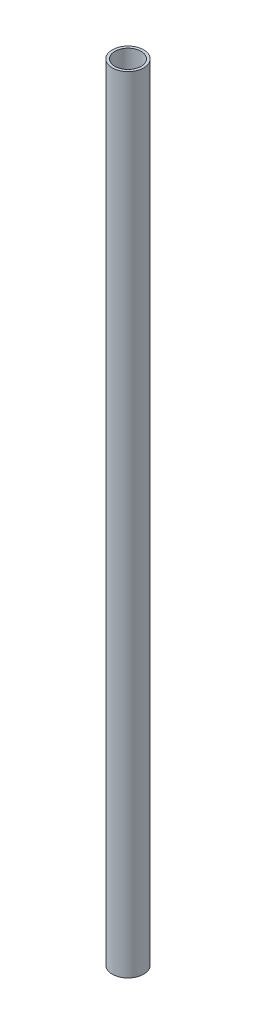
ISO-10303-21;
HEADER;
FILE_DESCRIPTION(('STEP AP214'),'2;1');
FILE_NAME('part.step','',(''),(''),'','','');
FILE_SCHEMA(('AUTOMOTIVE_DESIGN { 1 0 10303 214 1 1 1 1 }'));
ENDSEC;
DATA;
#1=APPLICATION_CONTEXT('core data for automotive mechanical design processes');
#2=APPLICATION_PROTOCOL_DEFINITION('international standard','automotive_design',2000,#1);
#3=PRODUCT_CONTEXT('',#1,'mechanical');
#4=PRODUCT('Part','Part','',(#3));
#5=PRODUCT_RELATED_PRODUCT_CATEGORY('part','',(#4));
#6=PRODUCT_DEFINITION_FORMATION('','',#4);
#7=PRODUCT_DEFINITION_CONTEXT('part definition',#1,'design');
#8=PRODUCT_DEFINITION('design','',#6,#7);
#9=PRODUCT_DEFINITION_SHAPE('','',#8);
#10=(LENGTH_UNIT() NAMED_UNIT(*) SI_UNIT(.MILLI.,.METRE.));
#11=(NAMED_UNIT(*) PLANE_ANGLE_UNIT() SI_UNIT($,.RADIAN.));
#12=(NAMED_UNIT(*) SI_UNIT($,.STERADIAN.) SOLID_ANGLE_UNIT());
#13=UNCERTAINTY_MEASURE_WITH_UNIT(LENGTH_MEASURE(1.E-05),#10,'distance_accuracy_value','');
#14=(GEOMETRIC_REPRESENTATION_CONTEXT(3) GLOBAL_UNCERTAINTY_ASSIGNED_CONTEXT((#13)) GLOBAL_UNIT_ASSIGNED_CONTEXT((#10,
#11,#12)) REPRESENTATION_CONTEXT('',''));
#15=CARTESIAN_POINT('',(0.,0.,0.));
#16=DIRECTION('',(0.,0.,1.));
#17=DIRECTION('',(1.,0.,0.));
#18=AXIS2_PLACEMENT_3D('',#15,#16,#17);
#19=CARTESIAN_POINT('',(0.,300.,0.));
#20=DIRECTION('',(0.,1.,0.));
#21=DIRECTION('',(0.,0.,1.));
#22=AXIS2_PLACEMENT_3D('',#19,#20,#21);
#23=PLANE('',#22);
#24=CARTESIAN_POINT('',(0.,300.,0.));
#25=DIRECTION('',(0.,1.,0.));
#26=DIRECTION('',(0.,0.,1.));
#27=AXIS2_PLACEMENT_3D('',#24,#25,#26);
#28=CIRCLE('',#27,6.);
#29=CARTESIAN_POINT('',(0.,300.,5.99999999999999));
#30=VERTEX_POINT('',#29);
#31=EDGE_CURVE('E10',#30,#30,#28,.T.);
#32=ORIENTED_EDGE('',*,*,#31,.T.);
#33=EDGE_LOOP('',(#32));
#34=FACE_BOUND('',#33,.T.);
#35=CARTESIAN_POINT('',(0.,300.,0.));
#36=DIRECTION('',(0.,1.,0.));
#37=DIRECTION('',(0.,0.,1.));
#38=AXIS2_PLACEMENT_3D('',#35,#36,#37);
#39=CIRCLE('',#38,5.);
#40=CARTESIAN_POINT('',(0.,300.,4.99999999999999));
#41=VERTEX_POINT('',#40);
#42=EDGE_CURVE('E43',#41,#41,#39,.T.);
#43=ORIENTED_EDGE('',*,*,#42,.F.);
#44=EDGE_LOOP('',(#43));
#45=FACE_BOUND('',#44,.T.);
#46=ADVANCED_FACE('F32',(#34,#45),#23,.T.);
#47=CARTESIAN_POINT('',(0.,0.,0.));
#48=DIRECTION('',(0.,1.,0.));
#49=DIRECTION('',(0.,0.,1.));
#50=AXIS2_PLACEMENT_3D('',#47,#48,#49);
#51=PLANE('',#50);
#52=CARTESIAN_POINT('',(0.,0.,0.));
#53=DIRECTION('',(0.,1.,0.));
#54=DIRECTION('',(0.,0.,1.));
#55=AXIS2_PLACEMENT_3D('',#52,#53,#54);
#56=CIRCLE('',#55,6.);
#57=CARTESIAN_POINT('',(0.,0.,6.));
#58=VERTEX_POINT('',#57);
#59=EDGE_CURVE('E36',#58,#58,#56,.T.);
#60=ORIENTED_EDGE('',*,*,#59,.F.);
#61=EDGE_LOOP('',(#60));
#62=FACE_BOUND('',#61,.T.);
#63=CARTESIAN_POINT('',(0.,0.,0.));
#64=DIRECTION('',(0.,1.,0.));
#65=DIRECTION('',(0.,0.,1.));
#66=AXIS2_PLACEMENT_3D('',#63,#64,#65);
#67=CIRCLE('',#66,5.);
#68=CARTESIAN_POINT('',(0.,0.,5.));
#69=VERTEX_POINT('',#68);
#70=EDGE_CURVE('E45',#69,#69,#67,.T.);
#71=ORIENTED_EDGE('',*,*,#70,.T.);
#72=EDGE_LOOP('',(#71));
#73=FACE_BOUND('',#72,.T.);
#74=ADVANCED_FACE('F55',(#62,#73),#51,.F.);
#75=CARTESIAN_POINT('',(0.,300.,0.));
#76=DIRECTION('',(0.,-1.,0.));
#77=DIRECTION('',(0.,0.,-1.));
#78=AXIS2_PLACEMENT_3D('',#75,#76,#77);
#79=CYLINDRICAL_SURFACE('',#78,6.);
#80=ORIENTED_EDGE('',*,*,#31,.F.);
#81=EDGE_LOOP('',(#80));
#82=FACE_BOUND('',#81,.T.);
#83=ORIENTED_EDGE('',*,*,#59,.T.);
#84=EDGE_LOOP('',(#83));
#85=FACE_BOUND('',#84,.T.);
#86=ADVANCED_FACE('F34',(#82,#85),#79,.T.);
#87=CARTESIAN_POINT('',(0.,300.,0.));
#88=DIRECTION('',(0.,-1.,0.));
#89=DIRECTION('',(0.,0.,-1.));
#90=AXIS2_PLACEMENT_3D('',#87,#88,#89);
#91=CYLINDRICAL_SURFACE('',#90,5.);
#92=ORIENTED_EDGE('',*,*,#42,.T.);
#93=EDGE_LOOP('',(#92));
#94=FACE_BOUND('',#93,.T.);
#95=ORIENTED_EDGE('',*,*,#70,.F.);
#96=EDGE_LOOP('',(#95));
#97=FACE_BOUND('',#96,.T.);
#98=ADVANCED_FACE('F51',(#94,#97),#91,.F.);
#99=CLOSED_SHELL('',(#46,#74,#86,#98));
#100=MANIFOLD_SOLID_BREP('B2',#99);
#101=ADVANCED_BREP_SHAPE_REPRESENTATION('',(#18,#100),#14);
#102=SHAPE_DEFINITION_REPRESENTATION(#9,#101);
ENDSEC;
END-ISO-10303-21;
